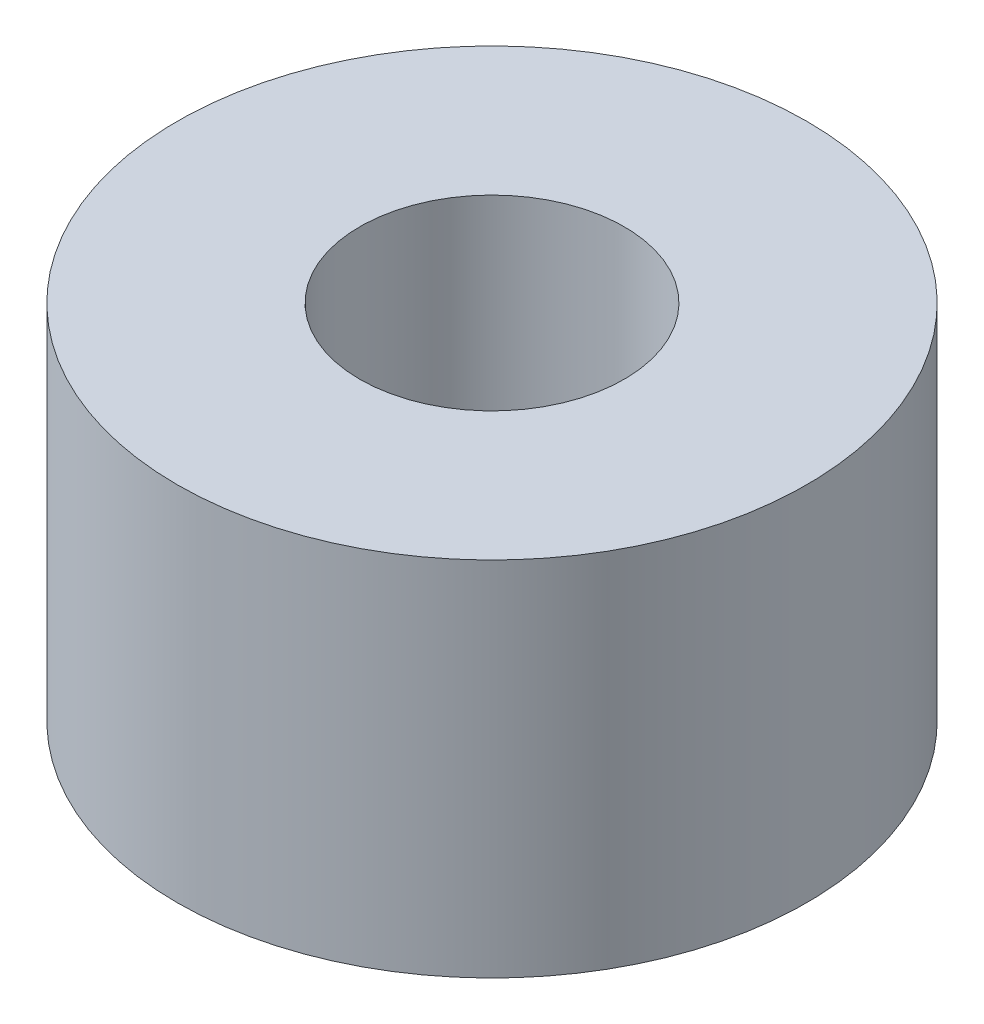
ISO-10303-21;
HEADER;
FILE_DESCRIPTION(('STEP AP214'),'2;1');
FILE_NAME('part.step','',(''),(''),'','','');
FILE_SCHEMA(('AUTOMOTIVE_DESIGN { 1 0 10303 214 1 1 1 1 }'));
ENDSEC;
DATA;
#1=APPLICATION_CONTEXT('core data for automotive mechanical design processes');
#2=APPLICATION_PROTOCOL_DEFINITION('international standard','automotive_design',2000,#1);
#3=PRODUCT_CONTEXT('',#1,'mechanical');
#4=PRODUCT('Part','Part','',(#3));
#5=PRODUCT_RELATED_PRODUCT_CATEGORY('part','',(#4));
#6=PRODUCT_DEFINITION_FORMATION('','',#4);
#7=PRODUCT_DEFINITION_CONTEXT('part definition',#1,'design');
#8=PRODUCT_DEFINITION('design','',#6,#7);
#9=PRODUCT_DEFINITION_SHAPE('','',#8);
#10=(LENGTH_UNIT() NAMED_UNIT(*) SI_UNIT(.MILLI.,.METRE.));
#11=(NAMED_UNIT(*) PLANE_ANGLE_UNIT() SI_UNIT($,.RADIAN.));
#12=(NAMED_UNIT(*) SI_UNIT($,.STERADIAN.) SOLID_ANGLE_UNIT());
#13=UNCERTAINTY_MEASURE_WITH_UNIT(LENGTH_MEASURE(1.E-05),#10,'distance_accuracy_value','');
#14=(GEOMETRIC_REPRESENTATION_CONTEXT(3) GLOBAL_UNCERTAINTY_ASSIGNED_CONTEXT((#13)) GLOBAL_UNIT_ASSIGNED_CONTEXT((#10,
#11,#12)) REPRESENTATION_CONTEXT('',''));
#15=CARTESIAN_POINT('',(0.,0.,0.));
#16=DIRECTION('',(0.,0.,1.));
#17=DIRECTION('',(1.,0.,0.));
#18=AXIS2_PLACEMENT_3D('',#15,#16,#17);
#19=CARTESIAN_POINT('',(0.,5.75,0.));
#20=DIRECTION('',(0.,1.,0.));
#21=DIRECTION('',(0.,0.,1.));
#22=AXIS2_PLACEMENT_3D('',#19,#20,#21);
#23=PLANE('',#22);
#24=CARTESIAN_POINT('',(0.,5.75,0.));
#25=DIRECTION('',(0.,1.,0.));
#26=DIRECTION('',(0.,0.,1.));
#27=AXIS2_PLACEMENT_3D('',#24,#25,#26);
#28=CIRCLE('',#27,5.);
#29=CARTESIAN_POINT('',(0.,5.75,5.));
#30=VERTEX_POINT('',#29);
#31=EDGE_CURVE('E10',#30,#30,#28,.T.);
#32=ORIENTED_EDGE('',*,*,#31,.T.);
#33=EDGE_LOOP('',(#32));
#34=FACE_BOUND('',#33,.T.);
#35=CARTESIAN_POINT('',(0.,5.75,0.));
#36=DIRECTION('',(0.,1.,0.));
#37=DIRECTION('',(0.,0.,1.));
#38=AXIS2_PLACEMENT_3D('',#35,#36,#37);
#39=CIRCLE('',#38,2.1);
#40=CARTESIAN_POINT('',(0.,5.75,2.1));
#41=VERTEX_POINT('',#40);
#42=EDGE_CURVE('E44',#41,#41,#39,.T.);
#43=ORIENTED_EDGE('',*,*,#42,.F.);
#44=EDGE_LOOP('',(#43));
#45=FACE_BOUND('',#44,.T.);
#46=ADVANCED_FACE('F33',(#34,#45),#23,.T.);
#47=CARTESIAN_POINT('',(0.,0.,0.));
#48=DIRECTION('',(0.,1.,0.));
#49=DIRECTION('',(0.,0.,1.));
#50=AXIS2_PLACEMENT_3D('',#47,#48,#49);
#51=PLANE('',#50);
#52=CARTESIAN_POINT('',(0.,0.,0.));
#53=DIRECTION('',(0.,1.,0.));
#54=DIRECTION('',(0.,0.,1.));
#55=AXIS2_PLACEMENT_3D('',#52,#53,#54);
#56=CIRCLE('',#55,5.);
#57=CARTESIAN_POINT('',(0.,0.,5.));
#58=VERTEX_POINT('',#57);
#59=EDGE_CURVE('E37',#58,#58,#56,.T.);
#60=ORIENTED_EDGE('',*,*,#59,.F.);
#61=EDGE_LOOP('',(#60));
#62=FACE_BOUND('',#61,.T.);
#63=CARTESIAN_POINT('',(0.,0.,0.));
#64=DIRECTION('',(0.,1.,0.));
#65=DIRECTION('',(0.,0.,1.));
#66=AXIS2_PLACEMENT_3D('',#63,#64,#65);
#67=CIRCLE('',#66,2.1);
#68=CARTESIAN_POINT('',(0.,0.,2.1));
#69=VERTEX_POINT('',#68);
#70=EDGE_CURVE('E46',#69,#69,#67,.T.);
#71=ORIENTED_EDGE('',*,*,#70,.T.);
#72=EDGE_LOOP('',(#71));
#73=FACE_BOUND('',#72,.T.);
#74=ADVANCED_FACE('F56',(#62,#73),#51,.F.);
#75=CARTESIAN_POINT('',(0.,5.75,0.));
#76=DIRECTION('',(0.,-1.,0.));
#77=DIRECTION('',(0.,0.,-1.));
#78=AXIS2_PLACEMENT_3D('',#75,#76,#77);
#79=CYLINDRICAL_SURFACE('',#78,5.);
#80=ORIENTED_EDGE('',*,*,#31,.F.);
#81=EDGE_LOOP('',(#80));
#82=FACE_BOUND('',#81,.T.);
#83=ORIENTED_EDGE('',*,*,#59,.T.);
#84=EDGE_LOOP('',(#83));
#85=FACE_BOUND('',#84,.T.);
#86=ADVANCED_FACE('F35',(#82,#85),#79,.T.);
#87=CARTESIAN_POINT('',(0.,5.75,0.));
#88=DIRECTION('',(0.,-1.,0.));
#89=DIRECTION('',(0.,0.,-1.));
#90=AXIS2_PLACEMENT_3D('',#87,#88,#89);
#91=CYLINDRICAL_SURFACE('',#90,2.1);
#92=ORIENTED_EDGE('',*,*,#42,.T.);
#93=EDGE_LOOP('',(#92));
#94=FACE_BOUND('',#93,.T.);
#95=ORIENTED_EDGE('',*,*,#70,.F.);
#96=EDGE_LOOP('',(#95));
#97=FACE_BOUND('',#96,.T.);
#98=ADVANCED_FACE('F52',(#94,#97),#91,.F.);
#99=CLOSED_SHELL('',(#46,#74,#86,#98));
#100=MANIFOLD_SOLID_BREP('B2',#99);
#101=ADVANCED_BREP_SHAPE_REPRESENTATION('',(#18,#100),#14);
#102=SHAPE_DEFINITION_REPRESENTATION(#9,#101);
ENDSEC;
END-ISO-10303-21;
